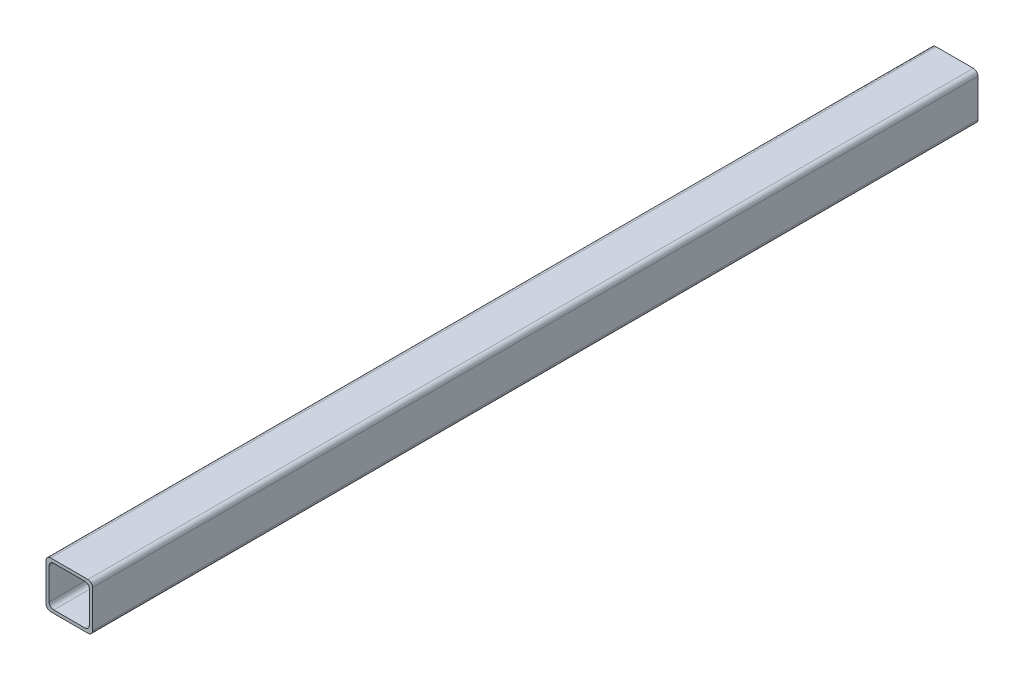
ISO-10303-21;
HEADER;
FILE_DESCRIPTION(('STEP AP214'),'2;1');
FILE_NAME('part.step','',(''),(''),'','','');
FILE_SCHEMA(('AUTOMOTIVE_DESIGN { 1 0 10303 214 1 1 1 1 }'));
ENDSEC;
DATA;
#1=APPLICATION_CONTEXT('core data for automotive mechanical design processes');
#2=APPLICATION_PROTOCOL_DEFINITION('international standard','automotive_design',2000,#1);
#3=PRODUCT_CONTEXT('',#1,'mechanical');
#4=PRODUCT('Part','Part','',(#3));
#5=PRODUCT_RELATED_PRODUCT_CATEGORY('part','',(#4));
#6=PRODUCT_DEFINITION_FORMATION('','',#4);
#7=PRODUCT_DEFINITION_CONTEXT('part definition',#1,'design');
#8=PRODUCT_DEFINITION('design','',#6,#7);
#9=PRODUCT_DEFINITION_SHAPE('','',#8);
#10=(LENGTH_UNIT() NAMED_UNIT(*) SI_UNIT(.MILLI.,.METRE.));
#11=(NAMED_UNIT(*) PLANE_ANGLE_UNIT() SI_UNIT($,.RADIAN.));
#12=(NAMED_UNIT(*) SI_UNIT($,.STERADIAN.) SOLID_ANGLE_UNIT());
#13=UNCERTAINTY_MEASURE_WITH_UNIT(LENGTH_MEASURE(1.E-05),#10,'distance_accuracy_value','');
#14=(GEOMETRIC_REPRESENTATION_CONTEXT(3) GLOBAL_UNCERTAINTY_ASSIGNED_CONTEXT((#13)) GLOBAL_UNIT_ASSIGNED_CONTEXT((#10,
#11,#12)) REPRESENTATION_CONTEXT('',''));
#15=CARTESIAN_POINT('',(0.,0.,0.));
#16=DIRECTION('',(0.,0.,1.));
#17=DIRECTION('',(1.,0.,0.));
#18=AXIS2_PLACEMENT_3D('',#15,#16,#17);
#19=CARTESIAN_POINT('',(12.,-12.,-570.));
#20=DIRECTION('',(0.,0.,1.));
#21=DIRECTION('',(1.,0.,0.));
#22=AXIS2_PLACEMENT_3D('',#19,#20,#21);
#23=CYLINDRICAL_SURFACE('',#22,3.);
#24=CARTESIAN_POINT('',(12.,-12.,0.));
#25=DIRECTION('',(0.,0.,1.));
#26=DIRECTION('',(1.,0.,0.));
#27=AXIS2_PLACEMENT_3D('',#24,#25,#26);
#28=CIRCLE('',#27,3.);
#29=CARTESIAN_POINT('',(12.,-15.,0.));
#30=VERTEX_POINT('',#29);
#31=CARTESIAN_POINT('',(15.,-12.,0.));
#32=VERTEX_POINT('',#31);
#33=EDGE_CURVE('E203',#30,#32,#28,.T.);
#34=ORIENTED_EDGE('',*,*,#33,.F.);
#35=DIRECTION('',(0.,0.,1.));
#36=VECTOR('',#35,1.);
#37=CARTESIAN_POINT('',(12.,-15.,-570.));
#38=LINE('',#37,#36);
#39=CARTESIAN_POINT('',(12.,-15.,-570.));
#40=VERTEX_POINT('',#39);
#41=EDGE_CURVE('E11',#40,#30,#38,.T.);
#42=ORIENTED_EDGE('',*,*,#41,.F.);
#43=CARTESIAN_POINT('',(12.,-12.,-570.));
#44=DIRECTION('',(0.,0.,1.));
#45=DIRECTION('',(1.,0.,0.));
#46=AXIS2_PLACEMENT_3D('',#43,#44,#45);
#47=CIRCLE('',#46,3.);
#48=CARTESIAN_POINT('',(15.,-12.,-570.));
#49=VERTEX_POINT('',#48);
#50=EDGE_CURVE('E215',#40,#49,#47,.T.);
#51=ORIENTED_EDGE('',*,*,#50,.T.);
#52=DIRECTION('',(0.,0.,1.));
#53=VECTOR('',#52,1.);
#54=CARTESIAN_POINT('',(15.,-12.,-570.));
#55=LINE('',#54,#53);
#56=EDGE_CURVE('E36',#49,#32,#55,.T.);
#57=ORIENTED_EDGE('',*,*,#56,.T.);
#58=EDGE_LOOP('',(#34,#42,#51,#57));
#59=FACE_BOUND('',#58,.T.);
#60=ADVANCED_FACE('F33',(#59),#23,.T.);
#61=CARTESIAN_POINT('',(-12.,-15.,-570.));
#62=DIRECTION('',(0.,-1.,0.));
#63=DIRECTION('',(0.,0.,-1.));
#64=AXIS2_PLACEMENT_3D('',#61,#62,#63);
#65=PLANE('',#64);
#66=DIRECTION('',(1.,0.,0.));
#67=VECTOR('',#66,1.);
#68=CARTESIAN_POINT('',(-12.,-15.,0.));
#69=LINE('',#68,#67);
#70=CARTESIAN_POINT('',(-12.,-15.,0.));
#71=VERTEX_POINT('',#70);
#72=EDGE_CURVE('E219',#71,#30,#69,.T.);
#73=ORIENTED_EDGE('',*,*,#72,.F.);
#74=DIRECTION('',(0.,0.,1.));
#75=VECTOR('',#74,1.);
#76=CARTESIAN_POINT('',(-12.,-15.,-570.));
#77=LINE('',#76,#75);
#78=CARTESIAN_POINT('',(-12.,-15.,-570.));
#79=VERTEX_POINT('',#78);
#80=EDGE_CURVE('E41',#79,#71,#77,.T.);
#81=ORIENTED_EDGE('',*,*,#80,.F.);
#82=DIRECTION('',(1.,0.,0.));
#83=VECTOR('',#82,1.);
#84=CARTESIAN_POINT('',(-12.,-15.,-570.));
#85=LINE('',#84,#83);
#86=EDGE_CURVE('E237',#79,#40,#85,.T.);
#87=ORIENTED_EDGE('',*,*,#86,.T.);
#88=ORIENTED_EDGE('',*,*,#41,.T.);
#89=EDGE_LOOP('',(#73,#81,#87,#88));
#90=FACE_BOUND('',#89,.T.);
#91=ADVANCED_FACE('F284',(#90),#65,.T.);
#92=CARTESIAN_POINT('',(-12.,-12.,-570.));
#93=DIRECTION('',(0.,0.,1.));
#94=DIRECTION('',(1.,0.,0.));
#95=AXIS2_PLACEMENT_3D('',#92,#93,#94);
#96=CYLINDRICAL_SURFACE('',#95,3.);
#97=CARTESIAN_POINT('',(-12.,-12.,0.));
#98=DIRECTION('',(0.,0.,1.));
#99=DIRECTION('',(-1.,0.,0.));
#100=AXIS2_PLACEMENT_3D('',#97,#98,#99);
#101=CIRCLE('',#100,3.);
#102=CARTESIAN_POINT('',(-15.,-12.,0.));
#103=VERTEX_POINT('',#102);
#104=EDGE_CURVE('E257',#103,#71,#101,.T.);
#105=ORIENTED_EDGE('',*,*,#104,.F.);
#106=DIRECTION('',(0.,0.,1.));
#107=VECTOR('',#106,1.);
#108=CARTESIAN_POINT('',(-15.,-12.,-570.));
#109=LINE('',#108,#107);
#110=CARTESIAN_POINT('',(-15.,-12.,-570.));
#111=VERTEX_POINT('',#110);
#112=EDGE_CURVE('E263',#111,#103,#109,.T.);
#113=ORIENTED_EDGE('',*,*,#112,.F.);
#114=CARTESIAN_POINT('',(-12.,-12.,-570.));
#115=DIRECTION('',(0.,0.,1.));
#116=DIRECTION('',(-1.,0.,0.));
#117=AXIS2_PLACEMENT_3D('',#114,#115,#116);
#118=CIRCLE('',#117,3.);
#119=EDGE_CURVE('E234',#111,#79,#118,.T.);
#120=ORIENTED_EDGE('',*,*,#119,.T.);
#121=ORIENTED_EDGE('',*,*,#80,.T.);
#122=EDGE_LOOP('',(#105,#113,#120,#121));
#123=FACE_BOUND('',#122,.T.);
#124=ADVANCED_FACE('F303',(#123),#96,.T.);
#125=CARTESIAN_POINT('',(-15.,-12.,-570.));
#126=DIRECTION('',(-1.,0.,0.));
#127=DIRECTION('',(0.,0.,1.));
#128=AXIS2_PLACEMENT_3D('',#125,#126,#127);
#129=PLANE('',#128);
#130=DIRECTION('',(0.,-1.,0.));
#131=VECTOR('',#130,1.);
#132=CARTESIAN_POINT('',(-15.,-12.,0.));
#133=LINE('',#132,#131);
#134=CARTESIAN_POINT('',(-15.,12.,0.));
#135=VERTEX_POINT('',#134);
#136=EDGE_CURVE('E254',#135,#103,#133,.T.);
#137=ORIENTED_EDGE('',*,*,#136,.F.);
#138=DIRECTION('',(0.,0.,1.));
#139=VECTOR('',#138,1.);
#140=CARTESIAN_POINT('',(-15.,12.,-570.));
#141=LINE('',#140,#139);
#142=CARTESIAN_POINT('',(-15.,12.,-570.));
#143=VERTEX_POINT('',#142);
#144=EDGE_CURVE('E265',#143,#135,#141,.T.);
#145=ORIENTED_EDGE('',*,*,#144,.F.);
#146=DIRECTION('',(0.,-1.,0.));
#147=VECTOR('',#146,1.);
#148=CARTESIAN_POINT('',(-15.,-12.,-570.));
#149=LINE('',#148,#147);
#150=EDGE_CURVE('E231',#143,#111,#149,.T.);
#151=ORIENTED_EDGE('',*,*,#150,.T.);
#152=ORIENTED_EDGE('',*,*,#112,.T.);
#153=EDGE_LOOP('',(#137,#145,#151,#152));
#154=FACE_BOUND('',#153,.T.);
#155=ADVANCED_FACE('F301',(#154),#129,.T.);
#156=CARTESIAN_POINT('',(-12.,12.,-570.));
#157=DIRECTION('',(0.,0.,1.));
#158=DIRECTION('',(1.,0.,0.));
#159=AXIS2_PLACEMENT_3D('',#156,#157,#158);
#160=CYLINDRICAL_SURFACE('',#159,3.);
#161=CARTESIAN_POINT('',(-12.,12.,0.));
#162=DIRECTION('',(0.,0.,1.));
#163=DIRECTION('',(-1.,0.,0.));
#164=AXIS2_PLACEMENT_3D('',#161,#162,#163);
#165=CIRCLE('',#164,3.);
#166=CARTESIAN_POINT('',(-12.,15.,0.));
#167=VERTEX_POINT('',#166);
#168=EDGE_CURVE('E251',#167,#135,#165,.T.);
#169=ORIENTED_EDGE('',*,*,#168,.F.);
#170=DIRECTION('',(0.,0.,1.));
#171=VECTOR('',#170,1.);
#172=CARTESIAN_POINT('',(-12.,15.,-570.));
#173=LINE('',#172,#171);
#174=CARTESIAN_POINT('',(-12.,15.,-570.));
#175=VERTEX_POINT('',#174);
#176=EDGE_CURVE('E267',#175,#167,#173,.T.);
#177=ORIENTED_EDGE('',*,*,#176,.F.);
#178=CARTESIAN_POINT('',(-12.,12.,-570.));
#179=DIRECTION('',(0.,0.,1.));
#180=DIRECTION('',(-1.,0.,0.));
#181=AXIS2_PLACEMENT_3D('',#178,#179,#180);
#182=CIRCLE('',#181,3.);
#183=EDGE_CURVE('E228',#175,#143,#182,.T.);
#184=ORIENTED_EDGE('',*,*,#183,.T.);
#185=ORIENTED_EDGE('',*,*,#144,.T.);
#186=EDGE_LOOP('',(#169,#177,#184,#185));
#187=FACE_BOUND('',#186,.T.);
#188=ADVANCED_FACE('F297',(#187),#160,.T.);
#189=CARTESIAN_POINT('',(-12.,15.,-570.));
#190=DIRECTION('',(0.,1.,0.));
#191=DIRECTION('',(0.,0.,1.));
#192=AXIS2_PLACEMENT_3D('',#189,#190,#191);
#193=PLANE('',#192);
#194=DIRECTION('',(-1.,0.,0.));
#195=VECTOR('',#194,1.);
#196=CARTESIAN_POINT('',(-12.,15.,0.));
#197=LINE('',#196,#195);
#198=CARTESIAN_POINT('',(12.,15.,0.));
#199=VERTEX_POINT('',#198);
#200=EDGE_CURVE('E248',#199,#167,#197,.T.);
#201=ORIENTED_EDGE('',*,*,#200,.F.);
#202=DIRECTION('',(0.,0.,1.));
#203=VECTOR('',#202,1.);
#204=CARTESIAN_POINT('',(12.,15.,-570.));
#205=LINE('',#204,#203);
#206=CARTESIAN_POINT('',(12.,15.,-570.));
#207=VERTEX_POINT('',#206);
#208=EDGE_CURVE('E269',#207,#199,#205,.T.);
#209=ORIENTED_EDGE('',*,*,#208,.F.);
#210=DIRECTION('',(-1.,0.,0.));
#211=VECTOR('',#210,1.);
#212=CARTESIAN_POINT('',(-12.,15.,-570.));
#213=LINE('',#212,#211);
#214=EDGE_CURVE('E225',#207,#175,#213,.T.);
#215=ORIENTED_EDGE('',*,*,#214,.T.);
#216=ORIENTED_EDGE('',*,*,#176,.T.);
#217=EDGE_LOOP('',(#201,#209,#215,#216));
#218=FACE_BOUND('',#217,.T.);
#219=ADVANCED_FACE('F295',(#218),#193,.T.);
#220=CARTESIAN_POINT('',(12.,12.,-570.));
#221=DIRECTION('',(0.,0.,1.));
#222=DIRECTION('',(1.,0.,0.));
#223=AXIS2_PLACEMENT_3D('',#220,#221,#222);
#224=CYLINDRICAL_SURFACE('',#223,3.);
#225=CARTESIAN_POINT('',(12.,12.,0.));
#226=DIRECTION('',(0.,0.,1.));
#227=DIRECTION('',(-1.,0.,0.));
#228=AXIS2_PLACEMENT_3D('',#225,#226,#227);
#229=CIRCLE('',#228,3.);
#230=CARTESIAN_POINT('',(15.,12.,0.));
#231=VERTEX_POINT('',#230);
#232=EDGE_CURVE('E245',#231,#199,#229,.T.);
#233=ORIENTED_EDGE('',*,*,#232,.F.);
#234=DIRECTION('',(0.,0.,1.));
#235=VECTOR('',#234,1.);
#236=CARTESIAN_POINT('',(15.,12.,-570.));
#237=LINE('',#236,#235);
#238=CARTESIAN_POINT('',(15.,12.,-570.));
#239=VERTEX_POINT('',#238);
#240=EDGE_CURVE('E270',#239,#231,#237,.T.);
#241=ORIENTED_EDGE('',*,*,#240,.F.);
#242=CARTESIAN_POINT('',(12.,12.,-570.));
#243=DIRECTION('',(0.,0.,1.));
#244=DIRECTION('',(-1.,0.,0.));
#245=AXIS2_PLACEMENT_3D('',#242,#243,#244);
#246=CIRCLE('',#245,3.);
#247=EDGE_CURVE('E222',#239,#207,#246,.T.);
#248=ORIENTED_EDGE('',*,*,#247,.T.);
#249=ORIENTED_EDGE('',*,*,#208,.T.);
#250=EDGE_LOOP('',(#233,#241,#248,#249));
#251=FACE_BOUND('',#250,.T.);
#252=ADVANCED_FACE('F291',(#251),#224,.T.);
#253=CARTESIAN_POINT('',(15.,-12.,-570.));
#254=DIRECTION('',(1.,0.,0.));
#255=DIRECTION('',(0.,0.,-1.));
#256=AXIS2_PLACEMENT_3D('',#253,#254,#255);
#257=PLANE('',#256);
#258=DIRECTION('',(0.,1.,0.));
#259=VECTOR('',#258,1.);
#260=CARTESIAN_POINT('',(15.,-12.,0.));
#261=LINE('',#260,#259);
#262=EDGE_CURVE('E242',#32,#231,#261,.T.);
#263=ORIENTED_EDGE('',*,*,#262,.F.);
#264=ORIENTED_EDGE('',*,*,#56,.F.);
#265=DIRECTION('',(0.,1.,0.));
#266=VECTOR('',#265,1.);
#267=CARTESIAN_POINT('',(15.,-12.,-570.));
#268=LINE('',#267,#266);
#269=EDGE_CURVE('E218',#49,#239,#268,.T.);
#270=ORIENTED_EDGE('',*,*,#269,.T.);
#271=ORIENTED_EDGE('',*,*,#240,.T.);
#272=EDGE_LOOP('',(#263,#264,#270,#271));
#273=FACE_BOUND('',#272,.T.);
#274=ADVANCED_FACE('F278',(#273),#257,.T.);
#275=CARTESIAN_POINT('',(12.,-12.,-570.));
#276=DIRECTION('',(0.,0.,1.));
#277=DIRECTION('',(1.,0.,0.));
#278=AXIS2_PLACEMENT_3D('',#275,#276,#277);
#279=PLANE('',#278);
#280=DIRECTION('',(1.,0.,0.));
#281=VECTOR('',#280,1.);
#282=CARTESIAN_POINT('',(-9.99999999999998,-13.,-570.));
#283=LINE('',#282,#281);
#284=CARTESIAN_POINT('',(-9.99999999999998,-13.,-570.));
#285=VERTEX_POINT('',#284);
#286=CARTESIAN_POINT('',(9.99999999999998,-13.,-570.));
#287=VERTEX_POINT('',#286);
#288=EDGE_CURVE('E154',#285,#287,#283,.T.);
#289=ORIENTED_EDGE('',*,*,#288,.T.);
#290=CARTESIAN_POINT('',(10.,-10.,-570.));
#291=DIRECTION('',(0.,0.,1.));
#292=DIRECTION('',(1.,0.,0.));
#293=AXIS2_PLACEMENT_3D('',#290,#291,#292);
#294=CIRCLE('',#293,3.);
#295=CARTESIAN_POINT('',(13.,-9.99999999999997,-570.));
#296=VERTEX_POINT('',#295);
#297=EDGE_CURVE('E148',#287,#296,#294,.T.);
#298=ORIENTED_EDGE('',*,*,#297,.T.);
#299=DIRECTION('',(0.,1.,0.));
#300=VECTOR('',#299,1.);
#301=CARTESIAN_POINT('',(13.,-9.99999999999997,-570.));
#302=LINE('',#301,#300);
#303=CARTESIAN_POINT('',(13.,9.99999999999997,-570.));
#304=VERTEX_POINT('',#303);
#305=EDGE_CURVE('E157',#296,#304,#302,.T.);
#306=ORIENTED_EDGE('',*,*,#305,.T.);
#307=CARTESIAN_POINT('',(10.,9.99999999999999,-570.));
#308=DIRECTION('',(0.,0.,1.));
#309=DIRECTION('',(-1.,0.,0.));
#310=AXIS2_PLACEMENT_3D('',#307,#308,#309);
#311=CIRCLE('',#310,3.);
#312=CARTESIAN_POINT('',(9.99999999999998,13.,-570.));
#313=VERTEX_POINT('',#312);
#314=EDGE_CURVE('E49',#304,#313,#311,.T.);
#315=ORIENTED_EDGE('',*,*,#314,.T.);
#316=DIRECTION('',(-1.,0.,0.));
#317=VECTOR('',#316,1.);
#318=CARTESIAN_POINT('',(-9.99999999999998,13.,-570.));
#319=LINE('',#318,#317);
#320=CARTESIAN_POINT('',(-9.99999999999998,13.,-570.));
#321=VERTEX_POINT('',#320);
#322=EDGE_CURVE('E172',#313,#321,#319,.T.);
#323=ORIENTED_EDGE('',*,*,#322,.T.);
#324=CARTESIAN_POINT('',(-10.,9.99999999999999,-570.));
#325=DIRECTION('',(0.,0.,1.));
#326=DIRECTION('',(-1.,0.,0.));
#327=AXIS2_PLACEMENT_3D('',#324,#325,#326);
#328=CIRCLE('',#327,3.);
#329=CARTESIAN_POINT('',(-13.,9.99999999999997,-570.));
#330=VERTEX_POINT('',#329);
#331=EDGE_CURVE('E175',#321,#330,#328,.T.);
#332=ORIENTED_EDGE('',*,*,#331,.T.);
#333=DIRECTION('',(0.,-1.,0.));
#334=VECTOR('',#333,1.);
#335=CARTESIAN_POINT('',(-13.,-9.99999999999998,-570.));
#336=LINE('',#335,#334);
#337=CARTESIAN_POINT('',(-13.,-10.,-570.));
#338=VERTEX_POINT('',#337);
#339=EDGE_CURVE('E178',#330,#338,#336,.T.);
#340=ORIENTED_EDGE('',*,*,#339,.T.);
#341=CARTESIAN_POINT('',(-10.,-10.,-570.));
#342=DIRECTION('',(0.,0.,1.));
#343=DIRECTION('',(-1.,0.,0.));
#344=AXIS2_PLACEMENT_3D('',#341,#342,#343);
#345=CIRCLE('',#344,3.);
#346=EDGE_CURVE('E181',#338,#285,#345,.T.);
#347=ORIENTED_EDGE('',*,*,#346,.T.);
#348=EDGE_LOOP('',(#289,#298,#306,#315,#323,#332,#340,#347));
#349=FACE_BOUND('',#348,.T.);
#350=ORIENTED_EDGE('',*,*,#50,.F.);
#351=ORIENTED_EDGE('',*,*,#86,.F.);
#352=ORIENTED_EDGE('',*,*,#119,.F.);
#353=ORIENTED_EDGE('',*,*,#150,.F.);
#354=ORIENTED_EDGE('',*,*,#183,.F.);
#355=ORIENTED_EDGE('',*,*,#214,.F.);
#356=ORIENTED_EDGE('',*,*,#247,.F.);
#357=ORIENTED_EDGE('',*,*,#269,.F.);
#358=EDGE_LOOP('',(#350,#351,#352,#353,#354,#355,#356,#357));
#359=FACE_BOUND('',#358,.T.);
#360=ADVANCED_FACE('F161',(#349,#359),#279,.F.);
#361=CARTESIAN_POINT('',(12.,-12.,0.));
#362=DIRECTION('',(0.,0.,1.));
#363=DIRECTION('',(1.,0.,0.));
#364=AXIS2_PLACEMENT_3D('',#361,#362,#363);
#365=PLANE('',#364);
#366=CARTESIAN_POINT('',(10.,-10.,0.));
#367=DIRECTION('',(0.,0.,1.));
#368=DIRECTION('',(1.,0.,0.));
#369=AXIS2_PLACEMENT_3D('',#366,#367,#368);
#370=CIRCLE('',#369,3.);
#371=CARTESIAN_POINT('',(9.99999999999998,-13.,0.));
#372=VERTEX_POINT('',#371);
#373=CARTESIAN_POINT('',(13.,-9.99999999999997,0.));
#374=VERTEX_POINT('',#373);
#375=EDGE_CURVE('E57',#372,#374,#370,.T.);
#376=ORIENTED_EDGE('',*,*,#375,.F.);
#377=DIRECTION('',(1.,0.,0.));
#378=VECTOR('',#377,1.);
#379=CARTESIAN_POINT('',(-9.99999999999998,-13.,0.));
#380=LINE('',#379,#378);
#381=CARTESIAN_POINT('',(-9.99999999999998,-13.,0.));
#382=VERTEX_POINT('',#381);
#383=EDGE_CURVE('E165',#382,#372,#380,.T.);
#384=ORIENTED_EDGE('',*,*,#383,.F.);
#385=CARTESIAN_POINT('',(-10.,-10.,0.));
#386=DIRECTION('',(0.,0.,1.));
#387=DIRECTION('',(-1.,0.,0.));
#388=AXIS2_PLACEMENT_3D('',#385,#386,#387);
#389=CIRCLE('',#388,3.);
#390=CARTESIAN_POINT('',(-13.,-10.,0.));
#391=VERTEX_POINT('',#390);
#392=EDGE_CURVE('E168',#391,#382,#389,.T.);
#393=ORIENTED_EDGE('',*,*,#392,.F.);
#394=DIRECTION('',(0.,-1.,0.));
#395=VECTOR('',#394,1.);
#396=CARTESIAN_POINT('',(-13.,-9.99999999999998,0.));
#397=LINE('',#396,#395);
#398=CARTESIAN_POINT('',(-13.,9.99999999999997,0.));
#399=VERTEX_POINT('',#398);
#400=EDGE_CURVE('E196',#399,#391,#397,.T.);
#401=ORIENTED_EDGE('',*,*,#400,.F.);
#402=CARTESIAN_POINT('',(-10.,9.99999999999999,0.));
#403=DIRECTION('',(0.,0.,1.));
#404=DIRECTION('',(-1.,0.,0.));
#405=AXIS2_PLACEMENT_3D('',#402,#403,#404);
#406=CIRCLE('',#405,3.);
#407=CARTESIAN_POINT('',(-9.99999999999998,13.,0.));
#408=VERTEX_POINT('',#407);
#409=EDGE_CURVE('E193',#408,#399,#406,.T.);
#410=ORIENTED_EDGE('',*,*,#409,.F.);
#411=DIRECTION('',(-1.,0.,0.));
#412=VECTOR('',#411,1.);
#413=CARTESIAN_POINT('',(-9.99999999999998,13.,0.));
#414=LINE('',#413,#412);
#415=CARTESIAN_POINT('',(9.99999999999998,13.,0.));
#416=VERTEX_POINT('',#415);
#417=EDGE_CURVE('E190',#416,#408,#414,.T.);
#418=ORIENTED_EDGE('',*,*,#417,.F.);
#419=CARTESIAN_POINT('',(10.,9.99999999999999,0.));
#420=DIRECTION('',(0.,0.,1.));
#421=DIRECTION('',(-1.,0.,0.));
#422=AXIS2_PLACEMENT_3D('',#419,#420,#421);
#423=CIRCLE('',#422,3.);
#424=CARTESIAN_POINT('',(13.,9.99999999999998,0.));
#425=VERTEX_POINT('',#424);
#426=EDGE_CURVE('E187',#425,#416,#423,.T.);
#427=ORIENTED_EDGE('',*,*,#426,.F.);
#428=DIRECTION('',(0.,1.,0.));
#429=VECTOR('',#428,1.);
#430=CARTESIAN_POINT('',(13.,-9.99999999999997,0.));
#431=LINE('',#430,#429);
#432=EDGE_CURVE('E185',#374,#425,#431,.T.);
#433=ORIENTED_EDGE('',*,*,#432,.F.);
#434=EDGE_LOOP('',(#376,#384,#393,#401,#410,#418,#427,#433));
#435=FACE_BOUND('',#434,.T.);
#436=ORIENTED_EDGE('',*,*,#33,.T.);
#437=ORIENTED_EDGE('',*,*,#262,.T.);
#438=ORIENTED_EDGE('',*,*,#232,.T.);
#439=ORIENTED_EDGE('',*,*,#200,.T.);
#440=ORIENTED_EDGE('',*,*,#168,.T.);
#441=ORIENTED_EDGE('',*,*,#136,.T.);
#442=ORIENTED_EDGE('',*,*,#104,.T.);
#443=ORIENTED_EDGE('',*,*,#72,.T.);
#444=EDGE_LOOP('',(#436,#437,#438,#439,#440,#441,#442,#443));
#445=FACE_BOUND('',#444,.T.);
#446=ADVANCED_FACE('F280',(#435,#445),#365,.T.);
#447=CARTESIAN_POINT('',(10.,-10.,-570.));
#448=DIRECTION('',(0.,0.,1.));
#449=DIRECTION('',(1.,0.,0.));
#450=AXIS2_PLACEMENT_3D('',#447,#448,#449);
#451=CYLINDRICAL_SURFACE('',#450,3.);
#452=ORIENTED_EDGE('',*,*,#375,.T.);
#453=DIRECTION('',(0.,0.,1.));
#454=VECTOR('',#453,1.);
#455=CARTESIAN_POINT('',(13.,-9.99999999999997,-570.));
#456=LINE('',#455,#454);
#457=EDGE_CURVE('E144',#296,#374,#456,.T.);
#458=ORIENTED_EDGE('',*,*,#457,.F.);
#459=ORIENTED_EDGE('',*,*,#297,.F.);
#460=DIRECTION('',(0.,0.,1.));
#461=VECTOR('',#460,1.);
#462=CARTESIAN_POINT('',(9.99999999999998,-13.,-570.));
#463=LINE('',#462,#461);
#464=EDGE_CURVE('E201',#287,#372,#463,.T.);
#465=ORIENTED_EDGE('',*,*,#464,.T.);
#466=EDGE_LOOP('',(#452,#458,#459,#465));
#467=FACE_BOUND('',#466,.T.);
#468=ADVANCED_FACE('F146',(#467),#451,.F.);
#469=CARTESIAN_POINT('',(-9.99999999999998,-13.,-570.));
#470=DIRECTION('',(0.,-1.,0.));
#471=DIRECTION('',(1.,0.,0.));
#472=AXIS2_PLACEMENT_3D('',#469,#470,#471);
#473=PLANE('',#472);
#474=ORIENTED_EDGE('',*,*,#383,.T.);
#475=ORIENTED_EDGE('',*,*,#464,.F.);
#476=ORIENTED_EDGE('',*,*,#288,.F.);
#477=DIRECTION('',(0.,0.,1.));
#478=VECTOR('',#477,1.);
#479=CARTESIAN_POINT('',(-9.99999999999998,-13.,-570.));
#480=LINE('',#479,#478);
#481=EDGE_CURVE('E204',#285,#382,#480,.T.);
#482=ORIENTED_EDGE('',*,*,#481,.T.);
#483=EDGE_LOOP('',(#474,#475,#476,#482));
#484=FACE_BOUND('',#483,.T.);
#485=ADVANCED_FACE('F386',(#484),#473,.F.);
#486=CARTESIAN_POINT('',(-10.,-10.,-570.));
#487=DIRECTION('',(0.,0.,1.));
#488=DIRECTION('',(1.,0.,0.));
#489=AXIS2_PLACEMENT_3D('',#486,#487,#488);
#490=CYLINDRICAL_SURFACE('',#489,3.);
#491=ORIENTED_EDGE('',*,*,#392,.T.);
#492=ORIENTED_EDGE('',*,*,#481,.F.);
#493=ORIENTED_EDGE('',*,*,#346,.F.);
#494=DIRECTION('',(0.,0.,1.));
#495=VECTOR('',#494,1.);
#496=CARTESIAN_POINT('',(-13.,-10.,-570.));
#497=LINE('',#496,#495);
#498=EDGE_CURVE('E206',#338,#391,#497,.T.);
#499=ORIENTED_EDGE('',*,*,#498,.T.);
#500=EDGE_LOOP('',(#491,#492,#493,#499));
#501=FACE_BOUND('',#500,.T.);
#502=ADVANCED_FACE('F395',(#501),#490,.F.);
#503=CARTESIAN_POINT('',(-13.,-9.99999999999998,-570.));
#504=DIRECTION('',(-1.,0.,0.));
#505=DIRECTION('',(0.,-1.,0.));
#506=AXIS2_PLACEMENT_3D('',#503,#504,#505);
#507=PLANE('',#506);
#508=ORIENTED_EDGE('',*,*,#400,.T.);
#509=ORIENTED_EDGE('',*,*,#498,.F.);
#510=ORIENTED_EDGE('',*,*,#339,.F.);
#511=DIRECTION('',(0.,0.,1.));
#512=VECTOR('',#511,1.);
#513=CARTESIAN_POINT('',(-13.,9.99999999999997,-570.));
#514=LINE('',#513,#512);
#515=EDGE_CURVE('E208',#330,#399,#514,.T.);
#516=ORIENTED_EDGE('',*,*,#515,.T.);
#517=EDGE_LOOP('',(#508,#509,#510,#516));
#518=FACE_BOUND('',#517,.T.);
#519=ADVANCED_FACE('F405',(#518),#507,.F.);
#520=CARTESIAN_POINT('',(-10.,9.99999999999999,-570.));
#521=DIRECTION('',(0.,0.,1.));
#522=DIRECTION('',(1.,0.,0.));
#523=AXIS2_PLACEMENT_3D('',#520,#521,#522);
#524=CYLINDRICAL_SURFACE('',#523,3.);
#525=ORIENTED_EDGE('',*,*,#409,.T.);
#526=ORIENTED_EDGE('',*,*,#515,.F.);
#527=ORIENTED_EDGE('',*,*,#331,.F.);
#528=DIRECTION('',(0.,0.,1.));
#529=VECTOR('',#528,1.);
#530=CARTESIAN_POINT('',(-9.99999999999998,13.,-570.));
#531=LINE('',#530,#529);
#532=EDGE_CURVE('E210',#321,#408,#531,.T.);
#533=ORIENTED_EDGE('',*,*,#532,.T.);
#534=EDGE_LOOP('',(#525,#526,#527,#533));
#535=FACE_BOUND('',#534,.T.);
#536=ADVANCED_FACE('F415',(#535),#524,.F.);
#537=CARTESIAN_POINT('',(-9.99999999999998,13.,-570.));
#538=DIRECTION('',(0.,1.,0.));
#539=DIRECTION('',(-1.,0.,0.));
#540=AXIS2_PLACEMENT_3D('',#537,#538,#539);
#541=PLANE('',#540);
#542=ORIENTED_EDGE('',*,*,#417,.T.);
#543=ORIENTED_EDGE('',*,*,#532,.F.);
#544=ORIENTED_EDGE('',*,*,#322,.F.);
#545=DIRECTION('',(0.,0.,1.));
#546=VECTOR('',#545,1.);
#547=CARTESIAN_POINT('',(9.99999999999998,13.,-570.));
#548=LINE('',#547,#546);
#549=EDGE_CURVE('E212',#313,#416,#548,.T.);
#550=ORIENTED_EDGE('',*,*,#549,.T.);
#551=EDGE_LOOP('',(#542,#543,#544,#550));
#552=FACE_BOUND('',#551,.T.);
#553=ADVANCED_FACE('F425',(#552),#541,.F.);
#554=CARTESIAN_POINT('',(10.,9.99999999999999,-570.));
#555=DIRECTION('',(0.,0.,1.));
#556=DIRECTION('',(1.,0.,0.));
#557=AXIS2_PLACEMENT_3D('',#554,#555,#556);
#558=CYLINDRICAL_SURFACE('',#557,3.);
#559=ORIENTED_EDGE('',*,*,#426,.T.);
#560=ORIENTED_EDGE('',*,*,#549,.F.);
#561=ORIENTED_EDGE('',*,*,#314,.F.);
#562=DIRECTION('',(0.,0.,1.));
#563=VECTOR('',#562,1.);
#564=CARTESIAN_POINT('',(13.,9.99999999999998,-570.));
#565=LINE('',#564,#563);
#566=EDGE_CURVE('E153',#304,#425,#565,.T.);
#567=ORIENTED_EDGE('',*,*,#566,.T.);
#568=EDGE_LOOP('',(#559,#560,#561,#567));
#569=FACE_BOUND('',#568,.T.);
#570=ADVANCED_FACE('F435',(#569),#558,.F.);
#571=CARTESIAN_POINT('',(13.,-9.99999999999997,-570.));
#572=DIRECTION('',(1.,0.,0.));
#573=DIRECTION('',(0.,0.,-1.));
#574=AXIS2_PLACEMENT_3D('',#571,#572,#573);
#575=PLANE('',#574);
#576=ORIENTED_EDGE('',*,*,#432,.T.);
#577=ORIENTED_EDGE('',*,*,#566,.F.);
#578=ORIENTED_EDGE('',*,*,#305,.F.);
#579=ORIENTED_EDGE('',*,*,#457,.T.);
#580=EDGE_LOOP('',(#576,#577,#578,#579));
#581=FACE_BOUND('',#580,.T.);
#582=ADVANCED_FACE('F158',(#581),#575,.F.);
#583=CLOSED_SHELL('',(#60,#91,#124,#155,#188,#219,#252,#274,#360,#446,#468,#485,#502,#519,#536,
#553,#570,#582));
#584=MANIFOLD_SOLID_BREP('B2',#583);
#585=ADVANCED_BREP_SHAPE_REPRESENTATION('',(#18,#584),#14);
#586=SHAPE_DEFINITION_REPRESENTATION(#9,#585);
ENDSEC;
END-ISO-10303-21;
